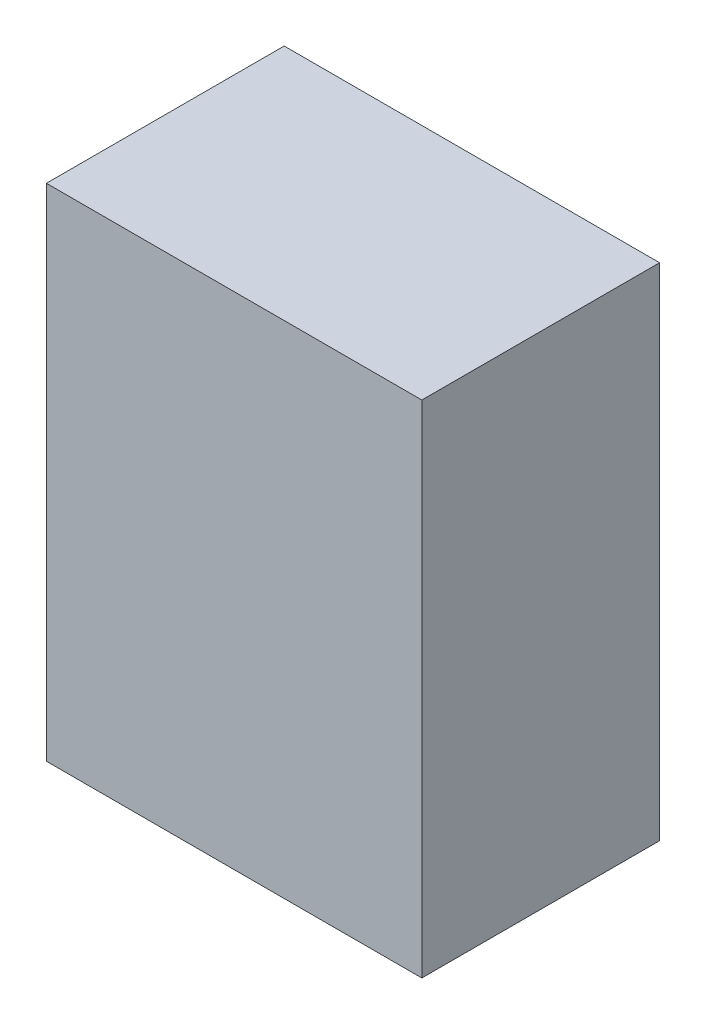
ISO-10303-21;
HEADER;
FILE_DESCRIPTION(('STEP AP214'),'2;1');
FILE_NAME('part.step','',(''),(''),'','','');
FILE_SCHEMA(('AUTOMOTIVE_DESIGN { 1 0 10303 214 1 1 1 1 }'));
ENDSEC;
DATA;
#1=APPLICATION_CONTEXT('core data for automotive mechanical design processes');
#2=APPLICATION_PROTOCOL_DEFINITION('international standard','automotive_design',2000,#1);
#3=PRODUCT_CONTEXT('',#1,'mechanical');
#4=PRODUCT('Part','Part','',(#3));
#5=PRODUCT_RELATED_PRODUCT_CATEGORY('part','',(#4));
#6=PRODUCT_DEFINITION_FORMATION('','',#4);
#7=PRODUCT_DEFINITION_CONTEXT('part definition',#1,'design');
#8=PRODUCT_DEFINITION('design','',#6,#7);
#9=PRODUCT_DEFINITION_SHAPE('','',#8);
#10=(LENGTH_UNIT() NAMED_UNIT(*) SI_UNIT(.MILLI.,.METRE.));
#11=(NAMED_UNIT(*) PLANE_ANGLE_UNIT() SI_UNIT($,.RADIAN.));
#12=(NAMED_UNIT(*) SI_UNIT($,.STERADIAN.) SOLID_ANGLE_UNIT());
#13=UNCERTAINTY_MEASURE_WITH_UNIT(LENGTH_MEASURE(1.E-05),#10,'distance_accuracy_value','');
#14=(GEOMETRIC_REPRESENTATION_CONTEXT(3) GLOBAL_UNCERTAINTY_ASSIGNED_CONTEXT((#13)) GLOBAL_UNIT_ASSIGNED_CONTEXT((#10,
#11,#12)) REPRESENTATION_CONTEXT('',''));
#15=CARTESIAN_POINT('',(0.,0.,0.));
#16=DIRECTION('',(0.,0.,1.));
#17=DIRECTION('',(1.,0.,0.));
#18=AXIS2_PLACEMENT_3D('',#15,#16,#17);
#19=CARTESIAN_POINT('',(0.75000104,1.00000054,0.95000064));
#20=DIRECTION('',(0.,0.,-1.));
#21=DIRECTION('',(-1.,0.,0.));
#22=AXIS2_PLACEMENT_3D('',#19,#20,#21);
#23=PLANE('',#22);
#24=DIRECTION('',(0.,1.,0.));
#25=VECTOR('',#24,1.);
#26=CARTESIAN_POINT('',(-0.75000104,1.00000054,0.95000064));
#27=LINE('',#26,#25);
#28=CARTESIAN_POINT('',(-0.75000104,1.00000054,0.95000064));
#29=VERTEX_POINT('',#28);
#30=CARTESIAN_POINT('',(-0.75000104,-1.00000054,0.95000064));
#31=VERTEX_POINT('',#30);
#32=EDGE_CURVE('E55',#29,#31,#27,.F.);
#33=ORIENTED_EDGE('',*,*,#32,.T.);
#34=DIRECTION('',(1.,0.,0.));
#35=VECTOR('',#34,1.);
#36=CARTESIAN_POINT('',(-0.75000104,-1.00000054,0.95000064));
#37=LINE('',#36,#35);
#38=CARTESIAN_POINT('',(0.75000104,-1.00000054,0.95000064));
#39=VERTEX_POINT('',#38);
#40=EDGE_CURVE('E58',#31,#39,#37,.T.);
#41=ORIENTED_EDGE('',*,*,#40,.T.);
#42=DIRECTION('',(0.,1.,0.));
#43=VECTOR('',#42,1.);
#44=CARTESIAN_POINT('',(0.75000104,-1.00000054,0.95000064));
#45=LINE('',#44,#43);
#46=CARTESIAN_POINT('',(0.75000104,1.00000054,0.95000064));
#47=VERTEX_POINT('',#46);
#48=EDGE_CURVE('E60',#39,#47,#45,.T.);
#49=ORIENTED_EDGE('',*,*,#48,.T.);
#50=DIRECTION('',(-1.,0.,0.));
#51=VECTOR('',#50,1.);
#52=CARTESIAN_POINT('',(0.75000104,1.00000054,0.95000064));
#53=LINE('',#52,#51);
#54=EDGE_CURVE('E20',#29,#47,#53,.F.);
#55=ORIENTED_EDGE('',*,*,#54,.F.);
#56=EDGE_LOOP('',(#33,#41,#49,#55));
#57=FACE_BOUND('',#56,.T.);
#58=ADVANCED_FACE('F17',(#57),#23,.F.);
#59=CARTESIAN_POINT('',(0.75000104,-1.00000054,0.));
#60=DIRECTION('',(-1.,0.,0.));
#61=DIRECTION('',(0.,0.,1.));
#62=AXIS2_PLACEMENT_3D('',#59,#60,#61);
#63=PLANE('',#62);
#64=DIRECTION('',(0.,0.,-1.));
#65=VECTOR('',#64,1.);
#66=CARTESIAN_POINT('',(0.75000104,1.00000054,0.));
#67=LINE('',#66,#65);
#68=CARTESIAN_POINT('',(0.75000104,1.00000054,0.));
#69=VERTEX_POINT('',#68);
#70=EDGE_CURVE('E71',#69,#47,#67,.F.);
#71=ORIENTED_EDGE('',*,*,#70,.T.);
#72=ORIENTED_EDGE('',*,*,#48,.F.);
#73=DIRECTION('',(0.,0.,1.));
#74=VECTOR('',#73,1.);
#75=CARTESIAN_POINT('',(0.75000104,-1.00000054,0.));
#76=LINE('',#75,#74);
#77=CARTESIAN_POINT('',(0.75000104,-1.00000054,0.));
#78=VERTEX_POINT('',#77);
#79=EDGE_CURVE('E65',#39,#78,#76,.F.);
#80=ORIENTED_EDGE('',*,*,#79,.T.);
#81=DIRECTION('',(0.,1.,0.));
#82=VECTOR('',#81,1.);
#83=CARTESIAN_POINT('',(0.75000104,1.00000054,0.));
#84=LINE('',#83,#82);
#85=EDGE_CURVE('E83',#69,#78,#84,.F.);
#86=ORIENTED_EDGE('',*,*,#85,.F.);
#87=EDGE_LOOP('',(#71,#72,#80,#86));
#88=FACE_BOUND('',#87,.T.);
#89=ADVANCED_FACE('F68',(#88),#63,.F.);
#90=CARTESIAN_POINT('',(-0.75000104,-1.00000054,0.));
#91=DIRECTION('',(0.,1.,0.));
#92=DIRECTION('',(0.,0.,1.));
#93=AXIS2_PLACEMENT_3D('',#90,#91,#92);
#94=PLANE('',#93);
#95=ORIENTED_EDGE('',*,*,#79,.F.);
#96=ORIENTED_EDGE('',*,*,#40,.F.);
#97=DIRECTION('',(0.,0.,-1.));
#98=VECTOR('',#97,1.);
#99=CARTESIAN_POINT('',(-0.75000104,-1.00000054,0.));
#100=LINE('',#99,#98);
#101=CARTESIAN_POINT('',(-0.75000104,-1.00000054,0.));
#102=VERTEX_POINT('',#101);
#103=EDGE_CURVE('E77',#31,#102,#100,.T.);
#104=ORIENTED_EDGE('',*,*,#103,.T.);
#105=DIRECTION('',(-1.,0.,0.));
#106=VECTOR('',#105,1.);
#107=CARTESIAN_POINT('',(0.75000104,-1.00000054,0.));
#108=LINE('',#107,#106);
#109=EDGE_CURVE('E74',#78,#102,#108,.T.);
#110=ORIENTED_EDGE('',*,*,#109,.F.);
#111=EDGE_LOOP('',(#95,#96,#104,#110));
#112=FACE_BOUND('',#111,.T.);
#113=ADVANCED_FACE('F72',(#112),#94,.F.);
#114=CARTESIAN_POINT('',(-0.75000104,1.00000054,0.));
#115=DIRECTION('',(1.,0.,0.));
#116=DIRECTION('',(0.,0.,-1.));
#117=AXIS2_PLACEMENT_3D('',#114,#115,#116);
#118=PLANE('',#117);
#119=ORIENTED_EDGE('',*,*,#103,.F.);
#120=ORIENTED_EDGE('',*,*,#32,.F.);
#121=DIRECTION('',(0.,0.,-1.));
#122=VECTOR('',#121,1.);
#123=CARTESIAN_POINT('',(-0.75000104,1.00000054,0.));
#124=LINE('',#123,#122);
#125=CARTESIAN_POINT('',(-0.75000104,1.00000054,0.));
#126=VERTEX_POINT('',#125);
#127=EDGE_CURVE('E35',#29,#126,#124,.T.);
#128=ORIENTED_EDGE('',*,*,#127,.T.);
#129=DIRECTION('',(0.,1.,0.));
#130=VECTOR('',#129,1.);
#131=CARTESIAN_POINT('',(-0.75000104,1.00000054,0.));
#132=LINE('',#131,#130);
#133=EDGE_CURVE('E26',#102,#126,#132,.T.);
#134=ORIENTED_EDGE('',*,*,#133,.F.);
#135=EDGE_LOOP('',(#119,#120,#128,#134));
#136=FACE_BOUND('',#135,.T.);
#137=ADVANCED_FACE('F89',(#136),#118,.F.);
#138=CARTESIAN_POINT('',(0.75000104,1.00000054,0.));
#139=DIRECTION('',(0.,-1.,0.));
#140=DIRECTION('',(0.,0.,-1.));
#141=AXIS2_PLACEMENT_3D('',#138,#139,#140);
#142=PLANE('',#141);
#143=ORIENTED_EDGE('',*,*,#127,.F.);
#144=ORIENTED_EDGE('',*,*,#54,.T.);
#145=ORIENTED_EDGE('',*,*,#70,.F.);
#146=DIRECTION('',(-1.,0.,0.));
#147=VECTOR('',#146,1.);
#148=CARTESIAN_POINT('',(0.75000104,1.00000054,0.));
#149=LINE('',#148,#147);
#150=EDGE_CURVE('E11',#126,#69,#149,.F.);
#151=ORIENTED_EDGE('',*,*,#150,.F.);
#152=EDGE_LOOP('',(#143,#144,#145,#151));
#153=FACE_BOUND('',#152,.T.);
#154=ADVANCED_FACE('F91',(#153),#142,.F.);
#155=CARTESIAN_POINT('',(0.75000104,1.00000054,0.));
#156=DIRECTION('',(0.,0.,-1.));
#157=DIRECTION('',(-1.,0.,0.));
#158=AXIS2_PLACEMENT_3D('',#155,#156,#157);
#159=PLANE('',#158);
#160=ORIENTED_EDGE('',*,*,#133,.T.);
#161=ORIENTED_EDGE('',*,*,#150,.T.);
#162=ORIENTED_EDGE('',*,*,#85,.T.);
#163=ORIENTED_EDGE('',*,*,#109,.T.);
#164=EDGE_LOOP('',(#160,#161,#162,#163));
#165=FACE_BOUND('',#164,.T.);
#166=ADVANCED_FACE('F88',(#165),#159,.T.);
#167=CLOSED_SHELL('',(#58,#89,#113,#137,#154,#166));
#168=MANIFOLD_SOLID_BREP('B1',#167);
#169=ADVANCED_BREP_SHAPE_REPRESENTATION('',(#18,#168),#14);
#170=SHAPE_DEFINITION_REPRESENTATION(#9,#169);
ENDSEC;
END-ISO-10303-21;
